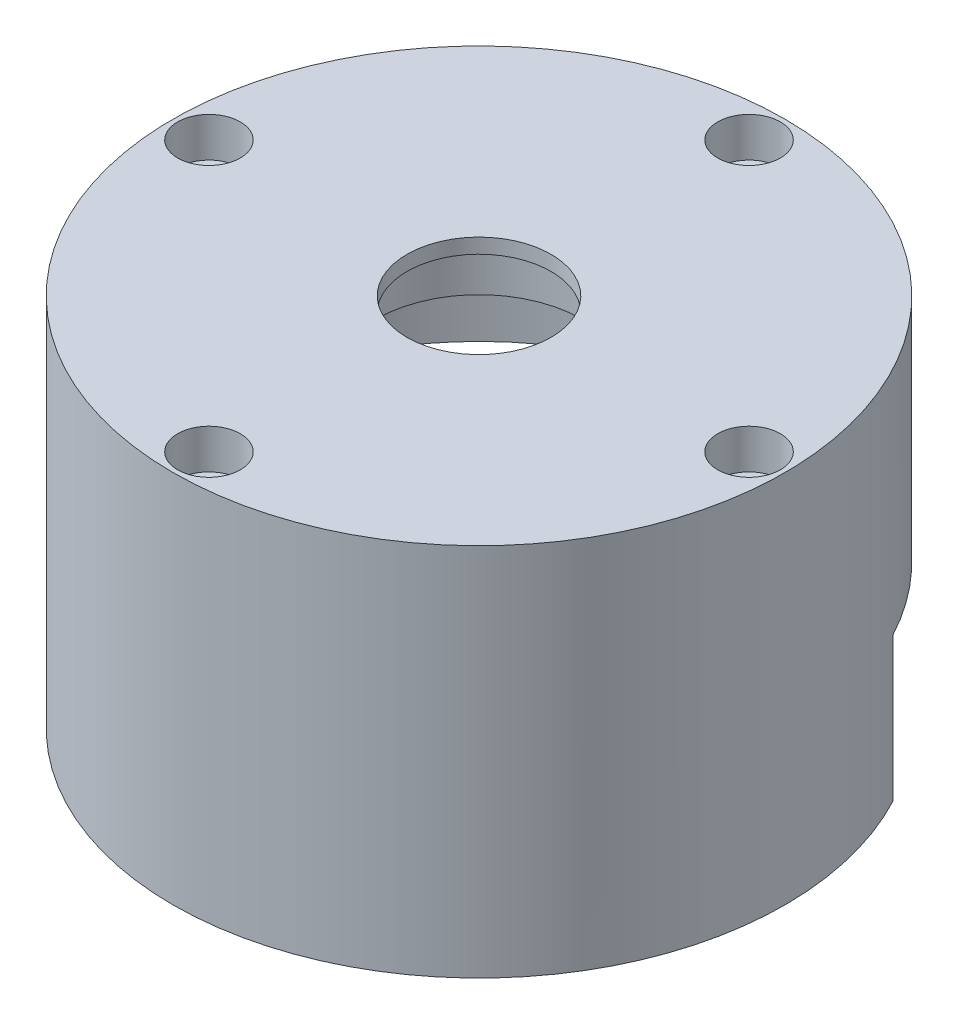
ISO-10303-21;
HEADER;
FILE_DESCRIPTION(('STEP AP214'),'2;1');
FILE_NAME('part.step','',(''),(''),'','','');
FILE_SCHEMA(('AUTOMOTIVE_DESIGN { 1 0 10303 214 1 1 1 1 }'));
ENDSEC;
DATA;
#1=APPLICATION_CONTEXT('core data for automotive mechanical design processes');
#2=APPLICATION_PROTOCOL_DEFINITION('international standard','automotive_design',2000,#1);
#3=PRODUCT_CONTEXT('',#1,'mechanical');
#4=PRODUCT('Part','Part','',(#3));
#5=PRODUCT_RELATED_PRODUCT_CATEGORY('part','',(#4));
#6=PRODUCT_DEFINITION_FORMATION('','',#4);
#7=PRODUCT_DEFINITION_CONTEXT('part definition',#1,'design');
#8=PRODUCT_DEFINITION('design','',#6,#7);
#9=PRODUCT_DEFINITION_SHAPE('','',#8);
#10=(LENGTH_UNIT() NAMED_UNIT(*) SI_UNIT(.MILLI.,.METRE.));
#11=(NAMED_UNIT(*) PLANE_ANGLE_UNIT() SI_UNIT($,.RADIAN.));
#12=(NAMED_UNIT(*) SI_UNIT($,.STERADIAN.) SOLID_ANGLE_UNIT());
#13=UNCERTAINTY_MEASURE_WITH_UNIT(LENGTH_MEASURE(1.E-05),#10,'distance_accuracy_value','');
#14=(GEOMETRIC_REPRESENTATION_CONTEXT(3) GLOBAL_UNCERTAINTY_ASSIGNED_CONTEXT((#13)) GLOBAL_UNIT_ASSIGNED_CONTEXT((#10,
#11,#12)) REPRESENTATION_CONTEXT('',''));
#15=CARTESIAN_POINT('',(0.,0.,0.));
#16=DIRECTION('',(0.,0.,1.));
#17=DIRECTION('',(1.,0.,0.));
#18=AXIS2_PLACEMENT_3D('',#15,#16,#17);
#19=CARTESIAN_POINT('',(-37.5,-42.,0.));
#20=DIRECTION('',(0.,1.,0.));
#21=DIRECTION('',(0.,0.,1.));
#22=AXIS2_PLACEMENT_3D('',#19,#20,#21);
#23=CYLINDRICAL_SURFACE('',#22,2.55);
#24=DIRECTION('',(0.,1.,0.));
#25=VECTOR('',#24,1.);
#26=CARTESIAN_POINT('',(-37.5,-42.,-2.55));
#27=LINE('',#26,#25);
#28=CARTESIAN_POINT('',(-37.5,-22.,-2.55));
#29=VERTEX_POINT('',#28);
#30=CARTESIAN_POINT('',(-37.5,-42.,-2.55));
#31=VERTEX_POINT('',#30);
#32=EDGE_CURVE('E12',#29,#31,#27,.F.);
#33=ORIENTED_EDGE('',*,*,#32,.F.);
#34=CARTESIAN_POINT('',(-37.5,-22.,0.));
#35=DIRECTION('',(0.,-1.,0.));
#36=DIRECTION('',(0.,0.,-1.));
#37=AXIS2_PLACEMENT_3D('',#34,#35,#36);
#38=CIRCLE('',#37,2.55);
#39=CARTESIAN_POINT('',(-37.4133,-22.,-2.54852567379648));
#40=VERTEX_POINT('',#39);
#41=EDGE_CURVE('E232',#40,#29,#38,.F.);
#42=ORIENTED_EDGE('',*,*,#41,.F.);
#43=DIRECTION('',(0.,1.,0.));
#44=VECTOR('',#43,1.);
#45=CARTESIAN_POINT('',(-37.4133,-22.,-2.54852567379652));
#46=LINE('',#45,#44);
#47=CARTESIAN_POINT('',(-37.4133,0.,-2.54852567379643));
#48=VERTEX_POINT('',#47);
#49=EDGE_CURVE('E266',#40,#48,#46,.T.);
#50=ORIENTED_EDGE('',*,*,#49,.T.);
#51=CARTESIAN_POINT('',(-37.5,0.,0.));
#52=DIRECTION('',(0.,1.,0.));
#53=DIRECTION('',(0.,0.,1.));
#54=AXIS2_PLACEMENT_3D('',#51,#52,#53);
#55=CIRCLE('',#54,2.55);
#56=CARTESIAN_POINT('',(-37.4133,0.,2.54852567379643));
#57=VERTEX_POINT('',#56);
#58=EDGE_CURVE('E261',#48,#57,#55,.F.);
#59=ORIENTED_EDGE('',*,*,#58,.T.);
#60=DIRECTION('',(0.,1.,0.));
#61=VECTOR('',#60,1.);
#62=CARTESIAN_POINT('',(-37.4133,-22.,2.54852567379652));
#63=LINE('',#62,#61);
#64=CARTESIAN_POINT('',(-37.4133,-42.,2.54852567379652));
#65=VERTEX_POINT('',#64);
#66=EDGE_CURVE('E283',#57,#65,#63,.F.);
#67=ORIENTED_EDGE('',*,*,#66,.T.);
#68=CARTESIAN_POINT('',(-37.5,-42.,0.));
#69=DIRECTION('',(0.,1.,0.));
#70=DIRECTION('',(0.,0.,1.));
#71=AXIS2_PLACEMENT_3D('',#68,#69,#70);
#72=CIRCLE('',#71,2.55);
#73=EDGE_CURVE('E182',#31,#65,#72,.T.);
#74=ORIENTED_EDGE('',*,*,#73,.F.);
#75=EDGE_LOOP('',(#33,#42,#50,#59,#67,#74));
#76=FACE_BOUND('',#75,.T.);
#77=CARTESIAN_POINT('',(-37.5,4.5,0.));
#78=DIRECTION('',(0.,1.,0.));
#79=DIRECTION('',(0.,0.,1.));
#80=AXIS2_PLACEMENT_3D('',#77,#78,#79);
#81=CIRCLE('',#80,2.55);
#82=CARTESIAN_POINT('',(-37.5,4.5,2.55));
#83=VERTEX_POINT('',#82);
#84=EDGE_CURVE('E38',#83,#83,#81,.F.);
#85=ORIENTED_EDGE('',*,*,#84,.F.);
#86=EDGE_LOOP('',(#85));
#87=FACE_BOUND('',#86,.T.);
#88=ADVANCED_FACE('F34',(#76,#87),#23,.F.);
#89=CARTESIAN_POINT('',(37.5,-42.,0.));
#90=DIRECTION('',(0.,1.,0.));
#91=DIRECTION('',(0.,0.,1.));
#92=AXIS2_PLACEMENT_3D('',#89,#90,#91);
#93=CYLINDRICAL_SURFACE('',#92,2.55);
#94=DIRECTION('',(0.,1.,0.));
#95=VECTOR('',#94,1.);
#96=CARTESIAN_POINT('',(37.5,-42.,-2.55));
#97=LINE('',#96,#95);
#98=CARTESIAN_POINT('',(37.5,-42.,-2.55));
#99=VERTEX_POINT('',#98);
#100=CARTESIAN_POINT('',(37.5,-22.,-2.55));
#101=VERTEX_POINT('',#100);
#102=EDGE_CURVE('E43',#99,#101,#97,.T.);
#103=ORIENTED_EDGE('',*,*,#102,.F.);
#104=CARTESIAN_POINT('',(37.5,-42.,0.));
#105=DIRECTION('',(0.,1.,0.));
#106=DIRECTION('',(0.,0.,1.));
#107=AXIS2_PLACEMENT_3D('',#104,#105,#106);
#108=CIRCLE('',#107,2.55);
#109=CARTESIAN_POINT('',(37.4133,-42.,2.54852567379652));
#110=VERTEX_POINT('',#109);
#111=EDGE_CURVE('E295',#110,#99,#108,.T.);
#112=ORIENTED_EDGE('',*,*,#111,.F.);
#113=DIRECTION('',(0.,1.,0.));
#114=VECTOR('',#113,1.);
#115=CARTESIAN_POINT('',(37.4133,-22.,2.54852567379652));
#116=LINE('',#115,#114);
#117=CARTESIAN_POINT('',(37.4133,0.,2.54852567379643));
#118=VERTEX_POINT('',#117);
#119=EDGE_CURVE('E273',#110,#118,#116,.T.);
#120=ORIENTED_EDGE('',*,*,#119,.T.);
#121=CARTESIAN_POINT('',(37.5,0.,0.));
#122=DIRECTION('',(0.,1.,0.));
#123=DIRECTION('',(0.,0.,1.));
#124=AXIS2_PLACEMENT_3D('',#121,#122,#123);
#125=CIRCLE('',#124,2.55);
#126=CARTESIAN_POINT('',(37.4133,0.,-2.54852567379643));
#127=VERTEX_POINT('',#126);
#128=EDGE_CURVE('E254',#118,#127,#125,.F.);
#129=ORIENTED_EDGE('',*,*,#128,.T.);
#130=DIRECTION('',(0.,1.,0.));
#131=VECTOR('',#130,1.);
#132=CARTESIAN_POINT('',(37.4133,-22.,-2.54852567379652));
#133=LINE('',#132,#131);
#134=CARTESIAN_POINT('',(37.4133,-22.,-2.54852567379652));
#135=VERTEX_POINT('',#134);
#136=EDGE_CURVE('E270',#127,#135,#133,.F.);
#137=ORIENTED_EDGE('',*,*,#136,.T.);
#138=CARTESIAN_POINT('',(37.5,-22.,0.));
#139=DIRECTION('',(0.,-1.,0.));
#140=DIRECTION('',(0.,0.,-1.));
#141=AXIS2_PLACEMENT_3D('',#138,#139,#140);
#142=CIRCLE('',#141,2.55);
#143=EDGE_CURVE('E51',#101,#135,#142,.F.);
#144=ORIENTED_EDGE('',*,*,#143,.F.);
#145=EDGE_LOOP('',(#103,#112,#120,#129,#137,#144));
#146=FACE_BOUND('',#145,.T.);
#147=CARTESIAN_POINT('',(37.5,4.5,0.));
#148=DIRECTION('',(0.,1.,0.));
#149=DIRECTION('',(0.,0.,1.));
#150=AXIS2_PLACEMENT_3D('',#147,#148,#149);
#151=CIRCLE('',#150,2.55);
#152=CARTESIAN_POINT('',(37.5,4.5,2.55));
#153=VERTEX_POINT('',#152);
#154=EDGE_CURVE('E207',#153,#153,#151,.F.);
#155=ORIENTED_EDGE('',*,*,#154,.F.);
#156=EDGE_LOOP('',(#155));
#157=FACE_BOUND('',#156,.T.);
#158=ADVANCED_FACE('F336',(#146,#157),#93,.F.);
#159=CARTESIAN_POINT('',(0.,-42.,37.5));
#160=DIRECTION('',(0.,1.,0.));
#161=DIRECTION('',(0.,0.,1.));
#162=AXIS2_PLACEMENT_3D('',#159,#160,#161);
#163=CYLINDRICAL_SURFACE('',#162,2.54999999999999);
#164=CARTESIAN_POINT('',(0.,-42.,37.5));
#165=DIRECTION('',(0.,1.,0.));
#166=DIRECTION('',(0.,0.,1.));
#167=AXIS2_PLACEMENT_3D('',#164,#165,#166);
#168=CIRCLE('',#167,2.54999999999999);
#169=CARTESIAN_POINT('',(-2.54852567379651,-42.,37.4133));
#170=VERTEX_POINT('',#169);
#171=CARTESIAN_POINT('',(2.54852567379651,-42.,37.4133));
#172=VERTEX_POINT('',#171);
#173=EDGE_CURVE('E297',#170,#172,#168,.T.);
#174=ORIENTED_EDGE('',*,*,#173,.F.);
#175=DIRECTION('',(0.,1.,0.));
#176=VECTOR('',#175,1.);
#177=CARTESIAN_POINT('',(-2.54852567379651,-22.,37.4133));
#178=LINE('',#177,#176);
#179=CARTESIAN_POINT('',(-2.54852567379643,0.,37.4133));
#180=VERTEX_POINT('',#179);
#181=EDGE_CURVE('E279',#170,#180,#178,.T.);
#182=ORIENTED_EDGE('',*,*,#181,.T.);
#183=CARTESIAN_POINT('',(0.,0.,37.5));
#184=DIRECTION('',(0.,1.,0.));
#185=DIRECTION('',(0.,0.,1.));
#186=AXIS2_PLACEMENT_3D('',#183,#184,#185);
#187=CIRCLE('',#186,2.54999999999999);
#188=CARTESIAN_POINT('',(2.54852567379643,0.,37.4133));
#189=VERTEX_POINT('',#188);
#190=EDGE_CURVE('E258',#180,#189,#187,.F.);
#191=ORIENTED_EDGE('',*,*,#190,.T.);
#192=DIRECTION('',(0.,1.,0.));
#193=VECTOR('',#192,1.);
#194=CARTESIAN_POINT('',(2.54852567379651,-22.,37.4133));
#195=LINE('',#194,#193);
#196=EDGE_CURVE('E276',#189,#172,#195,.F.);
#197=ORIENTED_EDGE('',*,*,#196,.T.);
#198=EDGE_LOOP('',(#174,#182,#191,#197));
#199=FACE_BOUND('',#198,.T.);
#200=CARTESIAN_POINT('',(0.,4.5,37.5));
#201=DIRECTION('',(0.,1.,0.));
#202=DIRECTION('',(0.,0.,1.));
#203=AXIS2_PLACEMENT_3D('',#200,#201,#202);
#204=CIRCLE('',#203,2.54999999999999);
#205=CARTESIAN_POINT('',(0.,4.5,40.05));
#206=VERTEX_POINT('',#205);
#207=EDGE_CURVE('E204',#206,#206,#204,.F.);
#208=ORIENTED_EDGE('',*,*,#207,.F.);
#209=EDGE_LOOP('',(#208));
#210=FACE_BOUND('',#209,.T.);
#211=ADVANCED_FACE('F328',(#199,#210),#163,.F.);
#212=CARTESIAN_POINT('',(0.,-42.,-37.5));
#213=DIRECTION('',(0.,1.,0.));
#214=DIRECTION('',(0.,0.,1.));
#215=AXIS2_PLACEMENT_3D('',#212,#213,#214);
#216=CYLINDRICAL_SURFACE('',#215,2.55);
#217=CARTESIAN_POINT('',(0.,-42.,-37.5));
#218=DIRECTION('',(0.,1.,0.));
#219=DIRECTION('',(0.,0.,1.));
#220=AXIS2_PLACEMENT_3D('',#217,#218,#219);
#221=CIRCLE('',#220,2.55);
#222=CARTESIAN_POINT('',(2.54852567379652,-42.,-37.4133));
#223=VERTEX_POINT('',#222);
#224=CARTESIAN_POINT('',(-2.54852567379652,-42.,-37.4133));
#225=VERTEX_POINT('',#224);
#226=EDGE_CURVE('E292',#223,#225,#221,.T.);
#227=ORIENTED_EDGE('',*,*,#226,.F.);
#228=DIRECTION('',(0.,1.,0.));
#229=VECTOR('',#228,1.);
#230=CARTESIAN_POINT('',(2.54852567379652,-22.,-37.4133));
#231=LINE('',#230,#229);
#232=CARTESIAN_POINT('',(2.54852567379643,0.,-37.4133));
#233=VERTEX_POINT('',#232);
#234=EDGE_CURVE('E188',#223,#233,#231,.T.);
#235=ORIENTED_EDGE('',*,*,#234,.T.);
#236=CARTESIAN_POINT('',(0.,0.,-37.5));
#237=DIRECTION('',(0.,1.,0.));
#238=DIRECTION('',(0.,0.,1.));
#239=AXIS2_PLACEMENT_3D('',#236,#237,#238);
#240=CIRCLE('',#239,2.55);
#241=CARTESIAN_POINT('',(-2.54852567379643,0.,-37.4133));
#242=VERTEX_POINT('',#241);
#243=EDGE_CURVE('E175',#233,#242,#240,.F.);
#244=ORIENTED_EDGE('',*,*,#243,.T.);
#245=DIRECTION('',(0.,1.,0.));
#246=VECTOR('',#245,1.);
#247=CARTESIAN_POINT('',(-2.54852567379652,-22.,-37.4133));
#248=LINE('',#247,#246);
#249=EDGE_CURVE('E179',#242,#225,#248,.F.);
#250=ORIENTED_EDGE('',*,*,#249,.T.);
#251=EDGE_LOOP('',(#227,#235,#244,#250));
#252=FACE_BOUND('',#251,.T.);
#253=CARTESIAN_POINT('',(0.,4.5,-37.5));
#254=DIRECTION('',(0.,1.,0.));
#255=DIRECTION('',(0.,0.,1.));
#256=AXIS2_PLACEMENT_3D('',#253,#254,#255);
#257=CIRCLE('',#256,2.55);
#258=CARTESIAN_POINT('',(0.,4.5,-34.95));
#259=VERTEX_POINT('',#258);
#260=EDGE_CURVE('E201',#259,#259,#257,.F.);
#261=ORIENTED_EDGE('',*,*,#260,.F.);
#262=EDGE_LOOP('',(#261));
#263=FACE_BOUND('',#262,.T.);
#264=ADVANCED_FACE('F349',(#252,#263),#216,.F.);
#265=CARTESIAN_POINT('',(0.,-42.,0.));
#266=DIRECTION('',(0.,1.,0.));
#267=DIRECTION('',(0.,0.,1.));
#268=AXIS2_PLACEMENT_3D('',#265,#266,#267);
#269=CYLINDRICAL_SURFACE('',#268,42.5);
#270=CARTESIAN_POINT('',(0.,10.,0.));
#271=DIRECTION('',(0.,1.,0.));
#272=DIRECTION('',(0.,0.,1.));
#273=AXIS2_PLACEMENT_3D('',#270,#271,#272);
#274=CIRCLE('',#273,42.5);
#275=CARTESIAN_POINT('',(0.,10.,42.5));
#276=VERTEX_POINT('',#275);
#277=EDGE_CURVE('E289',#276,#276,#274,.T.);
#278=ORIENTED_EDGE('',*,*,#277,.F.);
#279=EDGE_LOOP('',(#278));
#280=FACE_BOUND('',#279,.T.);
#281=CARTESIAN_POINT('',(0.,-42.,0.));
#282=DIRECTION('',(0.,1.,0.));
#283=DIRECTION('',(0.,0.,1.));
#284=AXIS2_PLACEMENT_3D('',#281,#282,#283);
#285=CIRCLE('',#284,42.5);
#286=CARTESIAN_POINT('',(12.5,-42.,-40.6201920231798));
#287=VERTEX_POINT('',#286);
#288=CARTESIAN_POINT('',(-12.5,-42.,-40.6201920231798));
#289=VERTEX_POINT('',#288);
#290=EDGE_CURVE('E165',#287,#289,#285,.T.);
#291=ORIENTED_EDGE('',*,*,#290,.T.);
#292=DIRECTION('',(0.,1.,0.));
#293=VECTOR('',#292,1.);
#294=CARTESIAN_POINT('',(-12.5,-42.,-40.6201920231798));
#295=LINE('',#294,#293);
#296=CARTESIAN_POINT('',(-12.5,-22.,-40.6201920231798));
#297=VERTEX_POINT('',#296);
#298=EDGE_CURVE('E169',#289,#297,#295,.T.);
#299=ORIENTED_EDGE('',*,*,#298,.T.);
#300=CARTESIAN_POINT('',(0.,-22.,0.));
#301=DIRECTION('',(0.,-1.,0.));
#302=DIRECTION('',(0.,0.,-1.));
#303=AXIS2_PLACEMENT_3D('',#300,#301,#302);
#304=CIRCLE('',#303,42.5);
#305=CARTESIAN_POINT('',(-37.5,-22.,-20.));
#306=VERTEX_POINT('',#305);
#307=EDGE_CURVE('E244',#297,#306,#304,.F.);
#308=ORIENTED_EDGE('',*,*,#307,.T.);
#309=DIRECTION('',(0.,1.,0.));
#310=VECTOR('',#309,1.);
#311=CARTESIAN_POINT('',(-37.5,-42.,-20.));
#312=LINE('',#311,#310);
#313=CARTESIAN_POINT('',(-37.5,-42.,-20.));
#314=VERTEX_POINT('',#313);
#315=EDGE_CURVE('E247',#306,#314,#312,.F.);
#316=ORIENTED_EDGE('',*,*,#315,.T.);
#317=CARTESIAN_POINT('',(37.5,-42.,-20.));
#318=VERTEX_POINT('',#317);
#319=EDGE_CURVE('E176',#314,#318,#285,.T.);
#320=ORIENTED_EDGE('',*,*,#319,.T.);
#321=DIRECTION('',(0.,1.,0.));
#322=VECTOR('',#321,1.);
#323=CARTESIAN_POINT('',(37.5,-42.,-20.));
#324=LINE('',#323,#322);
#325=CARTESIAN_POINT('',(37.5,-22.,-20.));
#326=VERTEX_POINT('',#325);
#327=EDGE_CURVE('E168',#318,#326,#324,.T.);
#328=ORIENTED_EDGE('',*,*,#327,.T.);
#329=CARTESIAN_POINT('',(12.5,-22.,-40.6201920231798));
#330=VERTEX_POINT('',#329);
#331=EDGE_CURVE('E167',#326,#330,#304,.F.);
#332=ORIENTED_EDGE('',*,*,#331,.T.);
#333=DIRECTION('',(0.,1.,0.));
#334=VECTOR('',#333,1.);
#335=CARTESIAN_POINT('',(12.5,-42.,-40.6201920231798));
#336=LINE('',#335,#334);
#337=EDGE_CURVE('E152',#330,#287,#336,.F.);
#338=ORIENTED_EDGE('',*,*,#337,.T.);
#339=EDGE_LOOP('',(#291,#299,#308,#316,#320,#328,#332,#338));
#340=FACE_BOUND('',#339,.T.);
#341=ADVANCED_FACE('F36',(#280,#340),#269,.T.);
#342=CARTESIAN_POINT('',(0.,-42.,0.));
#343=DIRECTION('',(0.,1.,0.));
#344=DIRECTION('',(0.,0.,1.));
#345=AXIS2_PLACEMENT_3D('',#342,#343,#344);
#346=PLANE('',#345);
#347=DIRECTION('',(0.,0.,-1.));
#348=VECTOR('',#347,1.);
#349=CARTESIAN_POINT('',(-12.5,-42.,0.));
#350=LINE('',#349,#348);
#351=CARTESIAN_POINT('',(-12.5,-42.,-35.3553390593274));
#352=VERTEX_POINT('',#351);
#353=EDGE_CURVE('E174',#352,#289,#350,.T.);
#354=ORIENTED_EDGE('',*,*,#353,.T.);
#355=ORIENTED_EDGE('',*,*,#290,.F.);
#356=DIRECTION('',(0.,0.,1.));
#357=VECTOR('',#356,1.);
#358=CARTESIAN_POINT('',(12.5,-42.,0.));
#359=LINE('',#358,#357);
#360=CARTESIAN_POINT('',(12.5,-42.,-35.3553390593274));
#361=VERTEX_POINT('',#360);
#362=EDGE_CURVE('E148',#287,#361,#359,.T.);
#363=ORIENTED_EDGE('',*,*,#362,.T.);
#364=CARTESIAN_POINT('',(0.,-42.,0.));
#365=DIRECTION('',(0.,1.,0.));
#366=DIRECTION('',(0.,0.,1.));
#367=AXIS2_PLACEMENT_3D('',#364,#365,#366);
#368=CIRCLE('',#367,37.5);
#369=EDGE_CURVE('E267',#361,#223,#368,.T.);
#370=ORIENTED_EDGE('',*,*,#369,.T.);
#371=ORIENTED_EDGE('',*,*,#226,.T.);
#372=EDGE_CURVE('E264',#225,#352,#368,.T.);
#373=ORIENTED_EDGE('',*,*,#372,.T.);
#374=EDGE_LOOP('',(#354,#355,#363,#370,#371,#373));
#375=FACE_BOUND('',#374,.T.);
#376=ADVANCED_FACE('F172',(#375),#346,.F.);
#377=DIRECTION('',(0.,0.,1.));
#378=VECTOR('',#377,1.);
#379=CARTESIAN_POINT('',(-37.5,-42.,0.));
#380=LINE('',#379,#378);
#381=EDGE_CURVE('E234',#314,#31,#380,.T.);
#382=ORIENTED_EDGE('',*,*,#381,.T.);
#383=ORIENTED_EDGE('',*,*,#73,.T.);
#384=EDGE_CURVE('E282',#65,#170,#368,.T.);
#385=ORIENTED_EDGE('',*,*,#384,.T.);
#386=ORIENTED_EDGE('',*,*,#173,.T.);
#387=EDGE_CURVE('E268',#172,#110,#368,.T.);
#388=ORIENTED_EDGE('',*,*,#387,.T.);
#389=ORIENTED_EDGE('',*,*,#111,.T.);
#390=DIRECTION('',(0.,0.,-1.));
#391=VECTOR('',#390,1.);
#392=CARTESIAN_POINT('',(37.5,-42.,0.));
#393=LINE('',#392,#391);
#394=EDGE_CURVE('E159',#99,#318,#393,.T.);
#395=ORIENTED_EDGE('',*,*,#394,.T.);
#396=ORIENTED_EDGE('',*,*,#319,.F.);
#397=EDGE_LOOP('',(#382,#383,#385,#386,#388,#389,#395,#396));
#398=FACE_BOUND('',#397,.T.);
#399=ADVANCED_FACE('F305',(#398),#346,.F.);
#400=CARTESIAN_POINT('',(0.,-44.,0.));
#401=DIRECTION('',(0.,1.,0.));
#402=DIRECTION('',(0.,0.,1.));
#403=AXIS2_PLACEMENT_3D('',#400,#401,#402);
#404=CYLINDRICAL_SURFACE('',#403,37.5);
#405=DIRECTION('',(0.,1.,0.));
#406=VECTOR('',#405,1.);
#407=CARTESIAN_POINT('',(12.5,-44.,-35.3553390593274));
#408=LINE('',#407,#406);
#409=CARTESIAN_POINT('',(12.5,-22.,-35.3553390593274));
#410=VERTEX_POINT('',#409);
#411=EDGE_CURVE('E155',#410,#361,#408,.F.);
#412=ORIENTED_EDGE('',*,*,#411,.F.);
#413=CARTESIAN_POINT('',(0.,-22.,0.));
#414=DIRECTION('',(0.,-1.,0.));
#415=DIRECTION('',(0.,0.,-1.));
#416=AXIS2_PLACEMENT_3D('',#413,#414,#415);
#417=CIRCLE('',#416,37.5);
#418=EDGE_CURVE('E240',#135,#410,#417,.F.);
#419=ORIENTED_EDGE('',*,*,#418,.F.);
#420=ORIENTED_EDGE('',*,*,#136,.F.);
#421=CARTESIAN_POINT('',(0.,0.,0.));
#422=DIRECTION('',(0.,1.,0.));
#423=DIRECTION('',(0.,0.,1.));
#424=AXIS2_PLACEMENT_3D('',#421,#422,#423);
#425=CIRCLE('',#424,37.5);
#426=EDGE_CURVE('E255',#127,#233,#425,.T.);
#427=ORIENTED_EDGE('',*,*,#426,.T.);
#428=ORIENTED_EDGE('',*,*,#234,.F.);
#429=ORIENTED_EDGE('',*,*,#369,.F.);
#430=EDGE_LOOP('',(#412,#419,#420,#427,#428,#429));
#431=FACE_BOUND('',#430,.T.);
#432=ADVANCED_FACE('F352',(#431),#404,.F.);
#433=DIRECTION('',(0.,1.,0.));
#434=VECTOR('',#433,1.);
#435=CARTESIAN_POINT('',(-12.5,-44.,-35.3553390593274));
#436=LINE('',#435,#434);
#437=CARTESIAN_POINT('',(-12.5,-22.,-35.3553390593274));
#438=VERTEX_POINT('',#437);
#439=EDGE_CURVE('E193',#352,#438,#436,.T.);
#440=ORIENTED_EDGE('',*,*,#439,.F.);
#441=ORIENTED_EDGE('',*,*,#372,.F.);
#442=ORIENTED_EDGE('',*,*,#249,.F.);
#443=EDGE_CURVE('E320',#242,#48,#425,.T.);
#444=ORIENTED_EDGE('',*,*,#443,.T.);
#445=ORIENTED_EDGE('',*,*,#49,.F.);
#446=CARTESIAN_POINT('',(0.,-22.,0.));
#447=DIRECTION('',(0.,-1.,0.));
#448=DIRECTION('',(0.,0.,-1.));
#449=AXIS2_PLACEMENT_3D('',#446,#447,#448);
#450=CIRCLE('',#449,37.5);
#451=EDGE_CURVE('E191',#438,#40,#450,.F.);
#452=ORIENTED_EDGE('',*,*,#451,.F.);
#453=EDGE_LOOP('',(#440,#441,#442,#444,#445,#452));
#454=FACE_BOUND('',#453,.T.);
#455=ADVANCED_FACE('F324',(#454),#404,.F.);
#456=CARTESIAN_POINT('',(0.,-42.,0.));
#457=DIRECTION('',(0.,1.,0.));
#458=DIRECTION('',(0.,0.,1.));
#459=AXIS2_PLACEMENT_3D('',#456,#457,#458);
#460=CYLINDRICAL_SURFACE('',#459,10.);
#461=CARTESIAN_POINT('',(0.,7.9375,0.));
#462=DIRECTION('',(0.,1.,0.));
#463=DIRECTION('',(0.,0.,1.));
#464=AXIS2_PLACEMENT_3D('',#461,#462,#463);
#465=CIRCLE('',#464,10.);
#466=CARTESIAN_POINT('',(0.,7.9375,10.));
#467=VERTEX_POINT('',#466);
#468=EDGE_CURVE('E197',#467,#467,#465,.F.);
#469=CARTESIAN_POINT('',(0.,10.,0.));
#470=DIRECTION('',(0.,1.,0.));
#471=DIRECTION('',(0.,0.,1.));
#472=AXIS2_PLACEMENT_3D('',#469,#470,#471);
#473=CIRCLE('',#472,10.);
#474=CARTESIAN_POINT('',(0.,9.99999999999999,10.));
#475=VERTEX_POINT('',#474);
#476=EDGE_CURVE('E286',#475,#475,#473,.T.);
#477=CARTESIAN_POINT('',(0.,7.9375,10.));
#478=CARTESIAN_POINT('',(0.,7.958984375,10.));
#479=CARTESIAN_POINT('',(0.,7.98046875,10.));
#480=CARTESIAN_POINT('',(0.,8.0234375,10.));
#481=CARTESIAN_POINT('',(0.,8.044921875,10.));
#482=CARTESIAN_POINT('',(0.,8.087890625,10.));
#483=CARTESIAN_POINT('',(0.,8.109375,10.));
#484=CARTESIAN_POINT('',(0.,8.15234375,10.));
#485=CARTESIAN_POINT('',(0.,8.173828125,10.));
#486=CARTESIAN_POINT('',(0.,8.216796875,10.));
#487=CARTESIAN_POINT('',(0.,8.23828125,10.));
#488=CARTESIAN_POINT('',(0.,8.28125,10.));
#489=CARTESIAN_POINT('',(0.,8.302734375,10.));
#490=CARTESIAN_POINT('',(0.,8.345703125,10.));
#491=CARTESIAN_POINT('',(0.,8.3671875,10.));
#492=CARTESIAN_POINT('',(0.,8.41015625,10.));
#493=CARTESIAN_POINT('',(0.,8.431640625,10.));
#494=CARTESIAN_POINT('',(0.,8.474609375,10.));
#495=CARTESIAN_POINT('',(0.,8.49609375,10.));
#496=CARTESIAN_POINT('',(0.,8.5390625,10.));
#497=CARTESIAN_POINT('',(0.,8.560546875,10.));
#498=CARTESIAN_POINT('',(0.,8.603515625,10.));
#499=CARTESIAN_POINT('',(0.,8.625,10.));
#500=CARTESIAN_POINT('',(0.,8.66796875,10.));
#501=CARTESIAN_POINT('',(0.,8.689453125,10.));
#502=CARTESIAN_POINT('',(0.,8.732421875,10.));
#503=CARTESIAN_POINT('',(0.,8.75390625,10.));
#504=CARTESIAN_POINT('',(0.,8.796875,10.));
#505=CARTESIAN_POINT('',(0.,8.818359375,10.));
#506=CARTESIAN_POINT('',(0.,8.861328125,10.));
#507=CARTESIAN_POINT('',(0.,8.8828125,10.));
#508=CARTESIAN_POINT('',(0.,8.92578124999999,10.));
#509=CARTESIAN_POINT('',(0.,8.947265625,10.));
#510=CARTESIAN_POINT('',(0.,8.990234375,10.));
#511=CARTESIAN_POINT('',(0.,9.01171875,10.));
#512=CARTESIAN_POINT('',(0.,9.0546875,10.));
#513=CARTESIAN_POINT('',(0.,9.076171875,10.));
#514=CARTESIAN_POINT('',(0.,9.119140625,10.));
#515=CARTESIAN_POINT('',(0.,9.140625,10.));
#516=CARTESIAN_POINT('',(0.,9.18359375,10.));
#517=CARTESIAN_POINT('',(0.,9.20507812499999,10.));
#518=CARTESIAN_POINT('',(0.,9.24804687499999,10.));
#519=CARTESIAN_POINT('',(0.,9.26953125,10.));
#520=CARTESIAN_POINT('',(0.,9.3125,10.));
#521=CARTESIAN_POINT('',(0.,9.333984375,10.));
#522=CARTESIAN_POINT('',(0.,9.376953125,10.));
#523=CARTESIAN_POINT('',(0.,9.39843749999999,10.));
#524=CARTESIAN_POINT('',(0.,9.44140624999999,10.));
#525=CARTESIAN_POINT('',(0.,9.462890625,10.));
#526=CARTESIAN_POINT('',(0.,9.505859375,10.));
#527=CARTESIAN_POINT('',(0.,9.52734375,10.));
#528=CARTESIAN_POINT('',(0.,9.5703125,10.));
#529=CARTESIAN_POINT('',(0.,9.591796875,10.));
#530=CARTESIAN_POINT('',(0.,9.63476562499999,10.));
#531=CARTESIAN_POINT('',(0.,9.65625,10.));
#532=CARTESIAN_POINT('',(0.,9.69921875,10.));
#533=CARTESIAN_POINT('',(0.,9.720703125,10.));
#534=CARTESIAN_POINT('',(0.,9.763671875,10.));
#535=CARTESIAN_POINT('',(0.,9.78515625,10.));
#536=CARTESIAN_POINT('',(0.,9.82812499999999,10.));
#537=CARTESIAN_POINT('',(0.,9.849609375,10.));
#538=CARTESIAN_POINT('',(0.,9.892578125,10.));
#539=CARTESIAN_POINT('',(0.,9.91406249999999,10.));
#540=CARTESIAN_POINT('',(0.,9.95703124999999,10.));
#541=CARTESIAN_POINT('',(0.,9.97851562499999,10.));
#542=CARTESIAN_POINT('',(0.,9.99999999999999,10.));
#543=B_SPLINE_CURVE_WITH_KNOTS('',3,(#477,#478,#479,#480,#481,#482,#483,#484,#485,#486,#487,
#488,#489,#490,#491,#492,#493,#494,#495,#496,#497,#498,#499,#500,#501,#502,#503,#504,#505,#506,
#507,#508,#509,#510,#511,#512,#513,#514,#515,#516,#517,#518,#519,#520,#521,#522,#523,#524,#525,
#526,#527,#528,#529,#530,#531,#532,#533,#534,#535,#536,#537,#538,#539,#540,#541,#542),
.UNSPECIFIED.,.F.,.F.,(4,2,2,2,2,2,2,2,2,2,2,2,2,2,2,2,2,2,2,2,2,2,2,2,2,2,2,2,2,2,2,2,4),(0.,
0.0644531250000024,0.128906249999998,0.193359375,0.257812499999996,0.322265624999998,
0.386718750000001,0.451171874999996,0.515624999999999,0.580078125000001,0.644531249999997,
0.708984374999999,0.773437500000002,0.837890624999997,0.90234375,0.966796874999995,1.03125,
1.095703125,1.16015625,1.224609375,1.28906249999999,1.353515625,1.41796875,1.48242187499999,
1.546875,1.611328125,1.67578124999999,1.740234375,1.8046875,1.86914062499999,1.93359375,
1.99804687499999,2.06249999999999),.UNSPECIFIED.);
#544=EDGE_CURVE('BSEAM372',#467,#475,#543,.T.);
#545=ORIENTED_EDGE('',*,*,#468,.T.);
#546=ORIENTED_EDGE('',*,*,#476,.T.);
#547=ORIENTED_EDGE('',*,*,#544,.T.);
#548=ORIENTED_EDGE('',*,*,#544,.F.);
#549=EDGE_LOOP('',(#545,#547,#546,#548));
#550=FACE_BOUND('',#549,.T.);
#551=ADVANCED_FACE('F372',(#550),#460,.F.);
#552=CARTESIAN_POINT('',(0.,10.,0.));
#553=DIRECTION('',(0.,1.,0.));
#554=DIRECTION('',(0.,0.,1.));
#555=AXIS2_PLACEMENT_3D('',#552,#553,#554);
#556=PLANE('',#555);
#557=CARTESIAN_POINT('',(0.,10.,-37.5));
#558=DIRECTION('',(0.,1.,0.));
#559=DIRECTION('',(0.,0.,1.));
#560=AXIS2_PLACEMENT_3D('',#557,#558,#559);
#561=CIRCLE('',#560,4.35);
#562=CARTESIAN_POINT('',(0.,10.,-33.15));
#563=VERTEX_POINT('',#562);
#564=EDGE_CURVE('E463',#563,#563,#561,.T.);
#565=ORIENTED_EDGE('',*,*,#564,.F.);
#566=EDGE_LOOP('',(#565));
#567=FACE_BOUND('',#566,.T.);
#568=CARTESIAN_POINT('',(37.5,10.,0.));
#569=DIRECTION('',(0.,1.,0.));
#570=DIRECTION('',(0.,0.,1.));
#571=AXIS2_PLACEMENT_3D('',#568,#569,#570);
#572=CIRCLE('',#571,4.35);
#573=CARTESIAN_POINT('',(37.5,10.,4.35));
#574=VERTEX_POINT('',#573);
#575=EDGE_CURVE('E471',#574,#574,#572,.T.);
#576=ORIENTED_EDGE('',*,*,#575,.F.);
#577=EDGE_LOOP('',(#576));
#578=FACE_BOUND('',#577,.T.);
#579=CARTESIAN_POINT('',(0.,10.,37.5));
#580=DIRECTION('',(0.,1.,0.));
#581=DIRECTION('',(0.,0.,1.));
#582=AXIS2_PLACEMENT_3D('',#579,#580,#581);
#583=CIRCLE('',#582,4.35);
#584=CARTESIAN_POINT('',(0.,10.,41.85));
#585=VERTEX_POINT('',#584);
#586=EDGE_CURVE('E477',#585,#585,#583,.T.);
#587=ORIENTED_EDGE('',*,*,#586,.F.);
#588=EDGE_LOOP('',(#587));
#589=FACE_BOUND('',#588,.T.);
#590=CARTESIAN_POINT('',(-37.5,10.,0.));
#591=DIRECTION('',(0.,1.,0.));
#592=DIRECTION('',(0.,0.,1.));
#593=AXIS2_PLACEMENT_3D('',#590,#591,#592);
#594=CIRCLE('',#593,4.35);
#595=CARTESIAN_POINT('',(-37.5,10.,4.35));
#596=VERTEX_POINT('',#595);
#597=EDGE_CURVE('E482',#596,#596,#594,.T.);
#598=ORIENTED_EDGE('',*,*,#597,.F.);
#599=EDGE_LOOP('',(#598));
#600=FACE_BOUND('',#599,.T.);
#601=ORIENTED_EDGE('',*,*,#277,.T.);
#602=EDGE_LOOP('',(#601));
#603=FACE_BOUND('',#602,.T.);
#604=ORIENTED_EDGE('',*,*,#476,.F.);
#605=EDGE_LOOP('',(#604));
#606=FACE_BOUND('',#605,.T.);
#607=ADVANCED_FACE('F374',(#567,#578,#589,#600,#603,#606),#556,.T.);
#608=EDGE_CURVE('E250',#57,#180,#425,.T.);
#609=ORIENTED_EDGE('',*,*,#608,.T.);
#610=ORIENTED_EDGE('',*,*,#181,.F.);
#611=ORIENTED_EDGE('',*,*,#384,.F.);
#612=ORIENTED_EDGE('',*,*,#66,.F.);
#613=EDGE_LOOP('',(#609,#610,#611,#612));
#614=FACE_BOUND('',#613,.T.);
#615=ADVANCED_FACE('F311',(#614),#404,.F.);
#616=EDGE_CURVE('E251',#189,#118,#425,.T.);
#617=ORIENTED_EDGE('',*,*,#616,.T.);
#618=ORIENTED_EDGE('',*,*,#119,.F.);
#619=ORIENTED_EDGE('',*,*,#387,.F.);
#620=ORIENTED_EDGE('',*,*,#196,.F.);
#621=EDGE_LOOP('',(#617,#618,#619,#620));
#622=FACE_BOUND('',#621,.T.);
#623=ADVANCED_FACE('F332',(#622),#404,.F.);
#624=CARTESIAN_POINT('',(0.,0.,0.));
#625=DIRECTION('',(0.,1.,0.));
#626=DIRECTION('',(0.,0.,1.));
#627=AXIS2_PLACEMENT_3D('',#624,#625,#626);
#628=PLANE('',#627);
#629=CARTESIAN_POINT('',(0.,0.,0.));
#630=DIRECTION('',(0.,1.,0.));
#631=DIRECTION('',(0.,0.,1.));
#632=AXIS2_PLACEMENT_3D('',#629,#630,#631);
#633=CIRCLE('',#632,14.35);
#634=CARTESIAN_POINT('',(0.,0.,14.35));
#635=VERTEX_POINT('',#634);
#636=EDGE_CURVE('E212',#635,#635,#633,.T.);
#637=ORIENTED_EDGE('',*,*,#636,.T.);
#638=EDGE_LOOP('',(#637));
#639=FACE_BOUND('',#638,.T.);
#640=ORIENTED_EDGE('',*,*,#443,.F.);
#641=ORIENTED_EDGE('',*,*,#243,.F.);
#642=ORIENTED_EDGE('',*,*,#426,.F.);
#643=ORIENTED_EDGE('',*,*,#128,.F.);
#644=ORIENTED_EDGE('',*,*,#616,.F.);
#645=ORIENTED_EDGE('',*,*,#190,.F.);
#646=ORIENTED_EDGE('',*,*,#608,.F.);
#647=ORIENTED_EDGE('',*,*,#58,.F.);
#648=EDGE_LOOP('',(#640,#641,#642,#643,#644,#645,#646,#647));
#649=FACE_BOUND('',#648,.T.);
#650=ADVANCED_FACE('F319',(#639,#649),#628,.F.);
#651=CARTESIAN_POINT('',(0.,-22.,0.));
#652=DIRECTION('',(0.,-1.,0.));
#653=DIRECTION('',(0.,0.,-1.));
#654=AXIS2_PLACEMENT_3D('',#651,#652,#653);
#655=PLANE('',#654);
#656=DIRECTION('',(0.,0.,-1.));
#657=VECTOR('',#656,1.);
#658=CARTESIAN_POINT('',(-12.5,-22.,0.));
#659=LINE('',#658,#657);
#660=EDGE_CURVE('E59',#438,#297,#659,.T.);
#661=ORIENTED_EDGE('',*,*,#660,.F.);
#662=ORIENTED_EDGE('',*,*,#451,.T.);
#663=ORIENTED_EDGE('',*,*,#41,.T.);
#664=DIRECTION('',(0.,0.,1.));
#665=VECTOR('',#664,1.);
#666=CARTESIAN_POINT('',(-37.5,-22.,0.));
#667=LINE('',#666,#665);
#668=EDGE_CURVE('E224',#306,#29,#667,.T.);
#669=ORIENTED_EDGE('',*,*,#668,.F.);
#670=ORIENTED_EDGE('',*,*,#307,.F.);
#671=EDGE_LOOP('',(#661,#662,#663,#669,#670));
#672=FACE_BOUND('',#671,.T.);
#673=ADVANCED_FACE('F344',(#672),#655,.T.);
#674=CARTESIAN_POINT('',(-12.5,-22.,0.));
#675=DIRECTION('',(-1.,0.,0.));
#676=DIRECTION('',(0.,0.,1.));
#677=AXIS2_PLACEMENT_3D('',#674,#675,#676);
#678=PLANE('',#677);
#679=ORIENTED_EDGE('',*,*,#353,.F.);
#680=ORIENTED_EDGE('',*,*,#439,.T.);
#681=ORIENTED_EDGE('',*,*,#660,.T.);
#682=ORIENTED_EDGE('',*,*,#298,.F.);
#683=EDGE_LOOP('',(#679,#680,#681,#682));
#684=FACE_BOUND('',#683,.T.);
#685=ADVANCED_FACE('F362',(#684),#678,.T.);
#686=CARTESIAN_POINT('',(-37.5,-22.,0.));
#687=DIRECTION('',(1.,0.,0.));
#688=DIRECTION('',(0.,0.,-1.));
#689=AXIS2_PLACEMENT_3D('',#686,#687,#688);
#690=PLANE('',#689);
#691=ORIENTED_EDGE('',*,*,#668,.T.);
#692=ORIENTED_EDGE('',*,*,#32,.T.);
#693=ORIENTED_EDGE('',*,*,#381,.F.);
#694=ORIENTED_EDGE('',*,*,#315,.F.);
#695=EDGE_LOOP('',(#691,#692,#693,#694));
#696=FACE_BOUND('',#695,.T.);
#697=ADVANCED_FACE('F343',(#696),#690,.T.);
#698=CARTESIAN_POINT('',(37.5,-22.,0.));
#699=DIRECTION('',(-1.,0.,0.));
#700=DIRECTION('',(0.,0.,1.));
#701=AXIS2_PLACEMENT_3D('',#698,#699,#700);
#702=PLANE('',#701);
#703=ORIENTED_EDGE('',*,*,#394,.F.);
#704=ORIENTED_EDGE('',*,*,#102,.T.);
#705=DIRECTION('',(0.,0.,-1.));
#706=VECTOR('',#705,1.);
#707=CARTESIAN_POINT('',(37.5,-22.,0.));
#708=LINE('',#707,#706);
#709=EDGE_CURVE('E227',#101,#326,#708,.T.);
#710=ORIENTED_EDGE('',*,*,#709,.T.);
#711=ORIENTED_EDGE('',*,*,#327,.F.);
#712=EDGE_LOOP('',(#703,#704,#710,#711));
#713=FACE_BOUND('',#712,.T.);
#714=ADVANCED_FACE('F354',(#713),#702,.T.);
#715=CARTESIAN_POINT('',(12.5,-22.,0.));
#716=DIRECTION('',(1.,0.,0.));
#717=DIRECTION('',(0.,0.,-1.));
#718=AXIS2_PLACEMENT_3D('',#715,#716,#717);
#719=PLANE('',#718);
#720=DIRECTION('',(0.,0.,1.));
#721=VECTOR('',#720,1.);
#722=CARTESIAN_POINT('',(12.5,-22.,0.));
#723=LINE('',#722,#721);
#724=EDGE_CURVE('E230',#330,#410,#723,.T.);
#725=ORIENTED_EDGE('',*,*,#724,.T.);
#726=ORIENTED_EDGE('',*,*,#411,.T.);
#727=ORIENTED_EDGE('',*,*,#362,.F.);
#728=ORIENTED_EDGE('',*,*,#337,.F.);
#729=EDGE_LOOP('',(#725,#726,#727,#728));
#730=FACE_BOUND('',#729,.T.);
#731=ADVANCED_FACE('F151',(#730),#719,.T.);
#732=ORIENTED_EDGE('',*,*,#709,.F.);
#733=ORIENTED_EDGE('',*,*,#143,.T.);
#734=ORIENTED_EDGE('',*,*,#418,.T.);
#735=ORIENTED_EDGE('',*,*,#724,.F.);
#736=ORIENTED_EDGE('',*,*,#331,.F.);
#737=EDGE_LOOP('',(#732,#733,#734,#735,#736));
#738=FACE_BOUND('',#737,.T.);
#739=ADVANCED_FACE('F353',(#738),#655,.T.);
#740=CARTESIAN_POINT('',(0.,7.9375,0.));
#741=DIRECTION('',(0.,1.,0.));
#742=DIRECTION('',(0.,0.,1.));
#743=AXIS2_PLACEMENT_3D('',#740,#741,#742);
#744=PLANE('',#743);
#745=CARTESIAN_POINT('',(0.,7.9375,0.));
#746=DIRECTION('',(0.,1.,0.));
#747=DIRECTION('',(0.,0.,1.));
#748=AXIS2_PLACEMENT_3D('',#745,#746,#747);
#749=CIRCLE('',#748,14.35);
#750=CARTESIAN_POINT('',(0.,7.9375,14.35));
#751=VERTEX_POINT('',#750);
#752=EDGE_CURVE('E200',#751,#751,#749,.T.);
#753=ORIENTED_EDGE('',*,*,#752,.F.);
#754=EDGE_LOOP('',(#753));
#755=FACE_BOUND('',#754,.T.);
#756=ORIENTED_EDGE('',*,*,#468,.F.);
#757=EDGE_LOOP('',(#756));
#758=FACE_BOUND('',#757,.T.);
#759=ADVANCED_FACE('F412',(#755,#758),#744,.F.);
#760=CARTESIAN_POINT('',(0.,7.9375,0.));
#761=DIRECTION('',(0.,-1.,0.));
#762=DIRECTION('',(0.,0.,-1.));
#763=AXIS2_PLACEMENT_3D('',#760,#761,#762);
#764=CYLINDRICAL_SURFACE('',#763,14.35);
#765=ORIENTED_EDGE('',*,*,#752,.T.);
#766=EDGE_LOOP('',(#765));
#767=FACE_BOUND('',#766,.T.);
#768=ORIENTED_EDGE('',*,*,#636,.F.);
#769=EDGE_LOOP('',(#768));
#770=FACE_BOUND('',#769,.T.);
#771=ADVANCED_FACE('F416',(#767,#770),#764,.F.);
#772=CARTESIAN_POINT('',(-37.5,4.5,0.));
#773=DIRECTION('',(0.,1.,0.));
#774=DIRECTION('',(0.,0.,1.));
#775=AXIS2_PLACEMENT_3D('',#772,#773,#774);
#776=PLANE('',#775);
#777=CARTESIAN_POINT('',(-37.5,4.5,0.));
#778=DIRECTION('',(0.,1.,0.));
#779=DIRECTION('',(0.,0.,1.));
#780=AXIS2_PLACEMENT_3D('',#777,#778,#779);
#781=CIRCLE('',#780,4.35);
#782=CARTESIAN_POINT('',(-37.5,4.5,4.35));
#783=VERTEX_POINT('',#782);
#784=EDGE_CURVE('E480',#783,#783,#781,.T.);
#785=ORIENTED_EDGE('',*,*,#784,.T.);
#786=EDGE_LOOP('',(#785));
#787=FACE_BOUND('',#786,.T.);
#788=ORIENTED_EDGE('',*,*,#84,.T.);
#789=EDGE_LOOP('',(#788));
#790=FACE_BOUND('',#789,.T.);
#791=ADVANCED_FACE('F422',(#787,#790),#776,.T.);
#792=CARTESIAN_POINT('',(-37.5,4.5,0.));
#793=DIRECTION('',(0.,1.,0.));
#794=DIRECTION('',(0.,0.,1.));
#795=AXIS2_PLACEMENT_3D('',#792,#793,#794);
#796=CYLINDRICAL_SURFACE('',#795,4.35);
#797=ORIENTED_EDGE('',*,*,#784,.F.);
#798=EDGE_LOOP('',(#797));
#799=FACE_BOUND('',#798,.T.);
#800=ORIENTED_EDGE('',*,*,#597,.T.);
#801=EDGE_LOOP('',(#800));
#802=FACE_BOUND('',#801,.T.);
#803=ADVANCED_FACE('F427',(#799,#802),#796,.F.);
#804=CARTESIAN_POINT('',(0.,4.5,37.5));
#805=DIRECTION('',(0.,1.,0.));
#806=DIRECTION('',(0.,0.,1.));
#807=AXIS2_PLACEMENT_3D('',#804,#805,#806);
#808=PLANE('',#807);
#809=CARTESIAN_POINT('',(0.,4.5,37.5));
#810=DIRECTION('',(0.,1.,0.));
#811=DIRECTION('',(0.,0.,1.));
#812=AXIS2_PLACEMENT_3D('',#809,#810,#811);
#813=CIRCLE('',#812,4.35);
#814=CARTESIAN_POINT('',(0.,4.5,41.85));
#815=VERTEX_POINT('',#814);
#816=EDGE_CURVE('E474',#815,#815,#813,.T.);
#817=ORIENTED_EDGE('',*,*,#816,.T.);
#818=EDGE_LOOP('',(#817));
#819=FACE_BOUND('',#818,.T.);
#820=ORIENTED_EDGE('',*,*,#207,.T.);
#821=EDGE_LOOP('',(#820));
#822=FACE_BOUND('',#821,.T.);
#823=ADVANCED_FACE('F430',(#819,#822),#808,.T.);
#824=CARTESIAN_POINT('',(0.,4.5,37.5));
#825=DIRECTION('',(0.,1.,0.));
#826=DIRECTION('',(0.,0.,1.));
#827=AXIS2_PLACEMENT_3D('',#824,#825,#826);
#828=CYLINDRICAL_SURFACE('',#827,4.35);
#829=ORIENTED_EDGE('',*,*,#816,.F.);
#830=EDGE_LOOP('',(#829));
#831=FACE_BOUND('',#830,.T.);
#832=ORIENTED_EDGE('',*,*,#586,.T.);
#833=EDGE_LOOP('',(#832));
#834=FACE_BOUND('',#833,.T.);
#835=ADVANCED_FACE('F435',(#831,#834),#828,.F.);
#836=CARTESIAN_POINT('',(37.5,4.5,0.));
#837=DIRECTION('',(0.,1.,0.));
#838=DIRECTION('',(0.,0.,1.));
#839=AXIS2_PLACEMENT_3D('',#836,#837,#838);
#840=PLANE('',#839);
#841=CARTESIAN_POINT('',(37.5,4.5,0.));
#842=DIRECTION('',(0.,1.,0.));
#843=DIRECTION('',(0.,0.,1.));
#844=AXIS2_PLACEMENT_3D('',#841,#842,#843);
#845=CIRCLE('',#844,4.35);
#846=CARTESIAN_POINT('',(37.5,4.5,4.35));
#847=VERTEX_POINT('',#846);
#848=EDGE_CURVE('E466',#847,#847,#845,.T.);
#849=ORIENTED_EDGE('',*,*,#848,.T.);
#850=EDGE_LOOP('',(#849));
#851=FACE_BOUND('',#850,.T.);
#852=ORIENTED_EDGE('',*,*,#154,.T.);
#853=EDGE_LOOP('',(#852));
#854=FACE_BOUND('',#853,.T.);
#855=ADVANCED_FACE('F438',(#851,#854),#840,.T.);
#856=CARTESIAN_POINT('',(37.5,4.5,0.));
#857=DIRECTION('',(0.,1.,0.));
#858=DIRECTION('',(0.,0.,1.));
#859=AXIS2_PLACEMENT_3D('',#856,#857,#858);
#860=CYLINDRICAL_SURFACE('',#859,4.35);
#861=ORIENTED_EDGE('',*,*,#848,.F.);
#862=EDGE_LOOP('',(#861));
#863=FACE_BOUND('',#862,.T.);
#864=ORIENTED_EDGE('',*,*,#575,.T.);
#865=EDGE_LOOP('',(#864));
#866=FACE_BOUND('',#865,.T.);
#867=ADVANCED_FACE('F443',(#863,#866),#860,.F.);
#868=CARTESIAN_POINT('',(0.,4.5,-37.5));
#869=DIRECTION('',(0.,1.,0.));
#870=DIRECTION('',(0.,0.,1.));
#871=AXIS2_PLACEMENT_3D('',#868,#869,#870);
#872=PLANE('',#871);
#873=CARTESIAN_POINT('',(0.,4.5,-37.5));
#874=DIRECTION('',(0.,1.,0.));
#875=DIRECTION('',(0.,0.,1.));
#876=AXIS2_PLACEMENT_3D('',#873,#874,#875);
#877=CIRCLE('',#876,4.35);
#878=CARTESIAN_POINT('',(0.,4.5,-33.15));
#879=VERTEX_POINT('',#878);
#880=EDGE_CURVE('E205',#879,#879,#877,.T.);
#881=ORIENTED_EDGE('',*,*,#880,.T.);
#882=EDGE_LOOP('',(#881));
#883=FACE_BOUND('',#882,.T.);
#884=ORIENTED_EDGE('',*,*,#260,.T.);
#885=EDGE_LOOP('',(#884));
#886=FACE_BOUND('',#885,.T.);
#887=ADVANCED_FACE('F446',(#883,#886),#872,.T.);
#888=CARTESIAN_POINT('',(0.,4.5,-37.5));
#889=DIRECTION('',(0.,1.,0.));
#890=DIRECTION('',(0.,0.,1.));
#891=AXIS2_PLACEMENT_3D('',#888,#889,#890);
#892=CYLINDRICAL_SURFACE('',#891,4.35);
#893=ORIENTED_EDGE('',*,*,#880,.F.);
#894=EDGE_LOOP('',(#893));
#895=FACE_BOUND('',#894,.T.);
#896=ORIENTED_EDGE('',*,*,#564,.T.);
#897=EDGE_LOOP('',(#896));
#898=FACE_BOUND('',#897,.T.);
#899=ADVANCED_FACE('F451',(#895,#898),#892,.F.);
#900=CLOSED_SHELL('',(#88,#158,#211,#264,#341,#376,#399,#432,#455,#551,#607,#615,#623,#650,#673,
#685,#697,#714,#731,#739,#759,#771,#791,#803,#823,#835,#855,#867,#887,#899));
#901=MANIFOLD_SOLID_BREP('B2',#900);
#902=ADVANCED_BREP_SHAPE_REPRESENTATION('',(#18,#901),#14);
#903=SHAPE_DEFINITION_REPRESENTATION(#9,#902);
ENDSEC;
END-ISO-10303-21;
